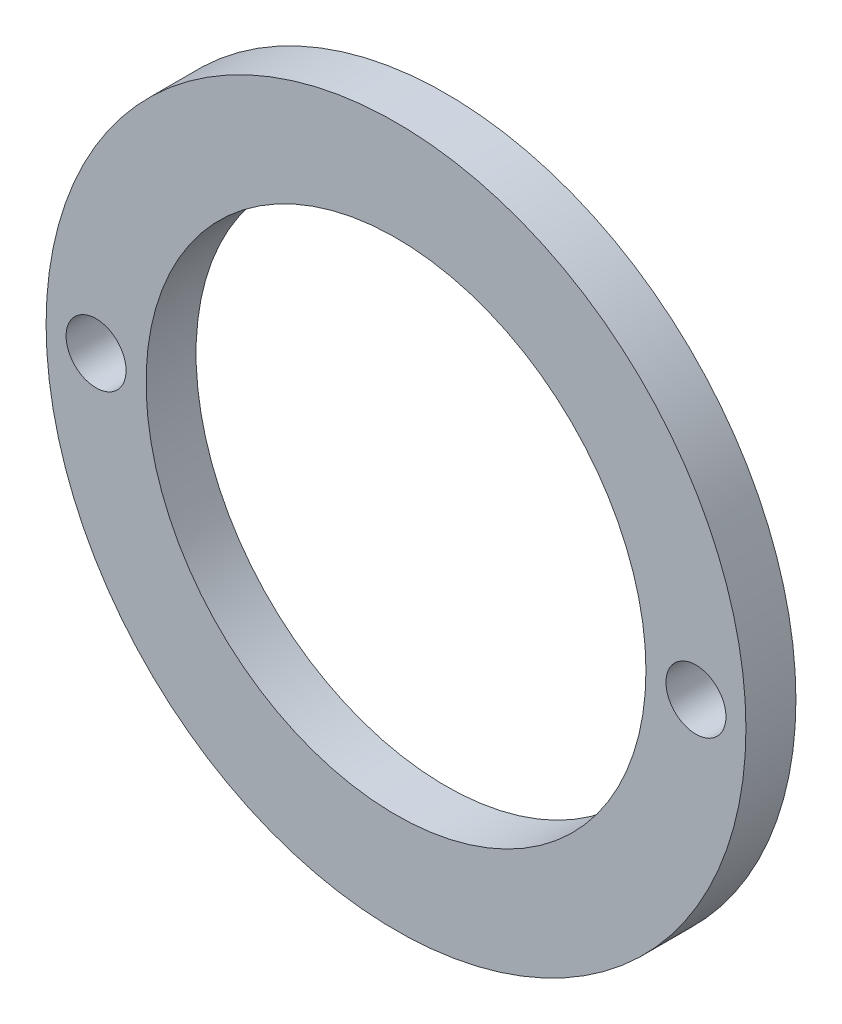
ISO-10303-21;
HEADER;
FILE_DESCRIPTION(('STEP AP214'),'2;1');
FILE_NAME('part.step','',(''),(''),'','','');
FILE_SCHEMA(('AUTOMOTIVE_DESIGN { 1 0 10303 214 1 1 1 1 }'));
ENDSEC;
DATA;
#1=APPLICATION_CONTEXT('core data for automotive mechanical design processes');
#2=APPLICATION_PROTOCOL_DEFINITION('international standard','automotive_design',2000,#1);
#3=PRODUCT_CONTEXT('',#1,'mechanical');
#4=PRODUCT('Part','Part','',(#3));
#5=PRODUCT_RELATED_PRODUCT_CATEGORY('part','',(#4));
#6=PRODUCT_DEFINITION_FORMATION('','',#4);
#7=PRODUCT_DEFINITION_CONTEXT('part definition',#1,'design');
#8=PRODUCT_DEFINITION('design','',#6,#7);
#9=PRODUCT_DEFINITION_SHAPE('','',#8);
#10=(LENGTH_UNIT() NAMED_UNIT(*) SI_UNIT(.MILLI.,.METRE.));
#11=(NAMED_UNIT(*) PLANE_ANGLE_UNIT() SI_UNIT($,.RADIAN.));
#12=(NAMED_UNIT(*) SI_UNIT($,.STERADIAN.) SOLID_ANGLE_UNIT());
#13=UNCERTAINTY_MEASURE_WITH_UNIT(LENGTH_MEASURE(1.E-05),#10,'distance_accuracy_value','');
#14=(GEOMETRIC_REPRESENTATION_CONTEXT(3) GLOBAL_UNCERTAINTY_ASSIGNED_CONTEXT((#13)) GLOBAL_UNIT_ASSIGNED_CONTEXT((#10,
#11,#12)) REPRESENTATION_CONTEXT('',''));
#15=CARTESIAN_POINT('',(0.,0.,0.));
#16=DIRECTION('',(0.,0.,1.));
#17=DIRECTION('',(1.,0.,0.));
#18=AXIS2_PLACEMENT_3D('',#15,#16,#17);
#19=CARTESIAN_POINT('',(0.,0.,0.));
#20=DIRECTION('',(0.,0.,1.));
#21=DIRECTION('',(1.,0.,0.));
#22=AXIS2_PLACEMENT_3D('',#19,#20,#21);
#23=PLANE('',#22);
#24=CARTESIAN_POINT('',(-6.,0.,0.));
#25=DIRECTION('',(0.,0.,1.));
#26=DIRECTION('',(1.,0.,0.));
#27=AXIS2_PLACEMENT_3D('',#24,#25,#26);
#28=CIRCLE('',#27,0.6);
#29=CARTESIAN_POINT('',(-5.4,0.,0.));
#30=VERTEX_POINT('',#29);
#31=EDGE_CURVE('E72',#30,#30,#28,.T.);
#32=ORIENTED_EDGE('',*,*,#31,.F.);
#33=EDGE_LOOP('',(#32));
#34=FACE_BOUND('',#33,.T.);
#35=CARTESIAN_POINT('',(6.,0.,0.));
#36=DIRECTION('',(0.,0.,1.));
#37=DIRECTION('',(1.,0.,0.));
#38=AXIS2_PLACEMENT_3D('',#35,#36,#37);
#39=CIRCLE('',#38,0.6);
#40=CARTESIAN_POINT('',(6.6,0.,0.));
#41=VERTEX_POINT('',#40);
#42=EDGE_CURVE('E70',#41,#41,#39,.T.);
#43=ORIENTED_EDGE('',*,*,#42,.F.);
#44=EDGE_LOOP('',(#43));
#45=FACE_BOUND('',#44,.T.);
#46=CARTESIAN_POINT('',(0.,0.,0.));
#47=DIRECTION('',(0.,0.,1.));
#48=DIRECTION('',(1.,0.,0.));
#49=AXIS2_PLACEMENT_3D('',#46,#47,#48);
#50=CIRCLE('',#49,7.);
#51=CARTESIAN_POINT('',(7.,0.,0.));
#52=VERTEX_POINT('',#51);
#53=EDGE_CURVE('E10',#52,#52,#50,.T.);
#54=ORIENTED_EDGE('',*,*,#53,.T.);
#55=EDGE_LOOP('',(#54));
#56=FACE_BOUND('',#55,.T.);
#57=CARTESIAN_POINT('',(0.,0.,0.));
#58=DIRECTION('',(0.,0.,1.));
#59=DIRECTION('',(1.,0.,0.));
#60=AXIS2_PLACEMENT_3D('',#57,#58,#59);
#61=CIRCLE('',#60,5.);
#62=CARTESIAN_POINT('',(5.,0.,0.));
#63=VERTEX_POINT('',#62);
#64=EDGE_CURVE('E52',#63,#63,#61,.T.);
#65=ORIENTED_EDGE('',*,*,#64,.F.);
#66=EDGE_LOOP('',(#65));
#67=FACE_BOUND('',#66,.T.);
#68=ADVANCED_FACE('F39',(#34,#45,#56,#67),#23,.T.);
#69=CARTESIAN_POINT('',(0.,0.,-1.));
#70=DIRECTION('',(0.,0.,1.));
#71=DIRECTION('',(1.,0.,0.));
#72=AXIS2_PLACEMENT_3D('',#69,#70,#71);
#73=PLANE('',#72);
#74=CARTESIAN_POINT('',(-6.,0.,-1.));
#75=DIRECTION('',(0.,0.,1.));
#76=DIRECTION('',(1.,0.,0.));
#77=AXIS2_PLACEMENT_3D('',#74,#75,#76);
#78=CIRCLE('',#77,0.6);
#79=CARTESIAN_POINT('',(-5.4,0.,-1.));
#80=VERTEX_POINT('',#79);
#81=EDGE_CURVE('E56',#80,#80,#78,.T.);
#82=ORIENTED_EDGE('',*,*,#81,.T.);
#83=EDGE_LOOP('',(#82));
#84=FACE_BOUND('',#83,.T.);
#85=CARTESIAN_POINT('',(6.,0.,-1.));
#86=DIRECTION('',(0.,0.,1.));
#87=DIRECTION('',(1.,0.,0.));
#88=AXIS2_PLACEMENT_3D('',#85,#86,#87);
#89=CIRCLE('',#88,0.6);
#90=CARTESIAN_POINT('',(6.6,0.,-1.));
#91=VERTEX_POINT('',#90);
#92=EDGE_CURVE('E62',#91,#91,#89,.T.);
#93=ORIENTED_EDGE('',*,*,#92,.T.);
#94=EDGE_LOOP('',(#93));
#95=FACE_BOUND('',#94,.T.);
#96=CARTESIAN_POINT('',(0.,0.,-1.));
#97=DIRECTION('',(0.,0.,1.));
#98=DIRECTION('',(1.,0.,0.));
#99=AXIS2_PLACEMENT_3D('',#96,#97,#98);
#100=CIRCLE('',#99,7.);
#101=CARTESIAN_POINT('',(7.,0.,-1.));
#102=VERTEX_POINT('',#101);
#103=EDGE_CURVE('E43',#102,#102,#100,.T.);
#104=ORIENTED_EDGE('',*,*,#103,.F.);
#105=EDGE_LOOP('',(#104));
#106=FACE_BOUND('',#105,.T.);
#107=CARTESIAN_POINT('',(0.,0.,-1.));
#108=DIRECTION('',(0.,0.,1.));
#109=DIRECTION('',(1.,0.,0.));
#110=AXIS2_PLACEMENT_3D('',#107,#108,#109);
#111=CIRCLE('',#110,5.);
#112=CARTESIAN_POINT('',(5.,0.,-1.));
#113=VERTEX_POINT('',#112);
#114=EDGE_CURVE('E54',#113,#113,#111,.T.);
#115=ORIENTED_EDGE('',*,*,#114,.T.);
#116=EDGE_LOOP('',(#115));
#117=FACE_BOUND('',#116,.T.);
#118=ADVANCED_FACE('F76',(#84,#95,#106,#117),#73,.F.);
#119=CARTESIAN_POINT('',(0.,0.,0.));
#120=DIRECTION('',(0.,0.,-1.));
#121=DIRECTION('',(-1.,0.,0.));
#122=AXIS2_PLACEMENT_3D('',#119,#120,#121);
#123=CYLINDRICAL_SURFACE('',#122,7.);
#124=ORIENTED_EDGE('',*,*,#53,.F.);
#125=EDGE_LOOP('',(#124));
#126=FACE_BOUND('',#125,.T.);
#127=ORIENTED_EDGE('',*,*,#103,.T.);
#128=EDGE_LOOP('',(#127));
#129=FACE_BOUND('',#128,.T.);
#130=ADVANCED_FACE('F41',(#126,#129),#123,.T.);
#131=CARTESIAN_POINT('',(0.,0.,0.));
#132=DIRECTION('',(0.,0.,-1.));
#133=DIRECTION('',(-1.,0.,0.));
#134=AXIS2_PLACEMENT_3D('',#131,#132,#133);
#135=CYLINDRICAL_SURFACE('',#134,5.);
#136=ORIENTED_EDGE('',*,*,#64,.T.);
#137=EDGE_LOOP('',(#136));
#138=FACE_BOUND('',#137,.T.);
#139=ORIENTED_EDGE('',*,*,#114,.F.);
#140=EDGE_LOOP('',(#139));
#141=FACE_BOUND('',#140,.T.);
#142=ADVANCED_FACE('F100',(#138,#141),#135,.F.);
#143=CARTESIAN_POINT('',(6.,0.,-1.));
#144=DIRECTION('',(0.,0.,1.));
#145=DIRECTION('',(1.,0.,0.));
#146=AXIS2_PLACEMENT_3D('',#143,#144,#145);
#147=CYLINDRICAL_SURFACE('',#146,0.6);
#148=ORIENTED_EDGE('',*,*,#92,.F.);
#149=EDGE_LOOP('',(#148));
#150=FACE_BOUND('',#149,.T.);
#151=ORIENTED_EDGE('',*,*,#42,.T.);
#152=EDGE_LOOP('',(#151));
#153=FACE_BOUND('',#152,.T.);
#154=ADVANCED_FACE('F88',(#150,#153),#147,.F.);
#155=CARTESIAN_POINT('',(-6.,0.,-1.));
#156=DIRECTION('',(0.,0.,1.));
#157=DIRECTION('',(1.,0.,0.));
#158=AXIS2_PLACEMENT_3D('',#155,#156,#157);
#159=CYLINDRICAL_SURFACE('',#158,0.6);
#160=ORIENTED_EDGE('',*,*,#81,.F.);
#161=EDGE_LOOP('',(#160));
#162=FACE_BOUND('',#161,.T.);
#163=ORIENTED_EDGE('',*,*,#31,.T.);
#164=EDGE_LOOP('',(#163));
#165=FACE_BOUND('',#164,.T.);
#166=ADVANCED_FACE('F83',(#162,#165),#159,.F.);
#167=CLOSED_SHELL('',(#68,#118,#130,#142,#154,#166));
#168=MANIFOLD_SOLID_BREP('B2',#167);
#169=ADVANCED_BREP_SHAPE_REPRESENTATION('',(#18,#168),#14);
#170=SHAPE_DEFINITION_REPRESENTATION(#9,#169);
ENDSEC;
END-ISO-10303-21;
